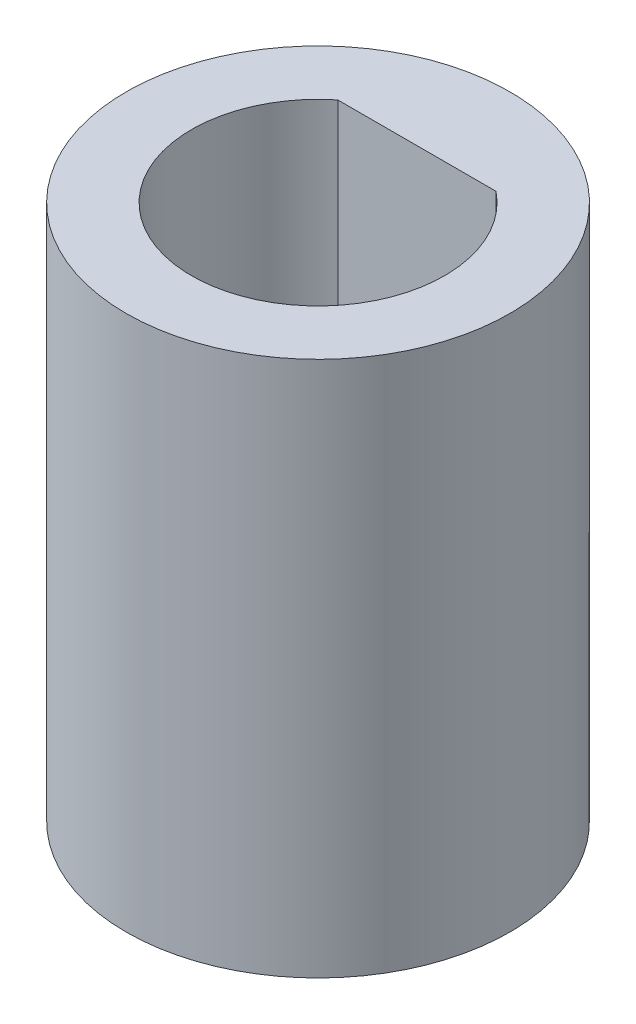
ISO-10303-21;
HEADER;
FILE_DESCRIPTION(('STEP AP214'),'2;1');
FILE_NAME('part.step','',(''),(''),'','','');
FILE_SCHEMA(('AUTOMOTIVE_DESIGN { 1 0 10303 214 1 1 1 1 }'));
ENDSEC;
DATA;
#1=APPLICATION_CONTEXT('core data for automotive mechanical design processes');
#2=APPLICATION_PROTOCOL_DEFINITION('international standard','automotive_design',2000,#1);
#3=PRODUCT_CONTEXT('',#1,'mechanical');
#4=PRODUCT('Part','Part','',(#3));
#5=PRODUCT_RELATED_PRODUCT_CATEGORY('part','',(#4));
#6=PRODUCT_DEFINITION_FORMATION('','',#4);
#7=PRODUCT_DEFINITION_CONTEXT('part definition',#1,'design');
#8=PRODUCT_DEFINITION('design','',#6,#7);
#9=PRODUCT_DEFINITION_SHAPE('','',#8);
#10=(LENGTH_UNIT() NAMED_UNIT(*) SI_UNIT(.MILLI.,.METRE.));
#11=(NAMED_UNIT(*) PLANE_ANGLE_UNIT() SI_UNIT($,.RADIAN.));
#12=(NAMED_UNIT(*) SI_UNIT($,.STERADIAN.) SOLID_ANGLE_UNIT());
#13=UNCERTAINTY_MEASURE_WITH_UNIT(LENGTH_MEASURE(1.E-05),#10,'distance_accuracy_value','');
#14=(GEOMETRIC_REPRESENTATION_CONTEXT(3) GLOBAL_UNCERTAINTY_ASSIGNED_CONTEXT((#13)) GLOBAL_UNIT_ASSIGNED_CONTEXT((#10,
#11,#12)) REPRESENTATION_CONTEXT('',''));
#15=CARTESIAN_POINT('',(0.,0.,0.));
#16=DIRECTION('',(0.,0.,1.));
#17=DIRECTION('',(1.,0.,0.));
#18=AXIS2_PLACEMENT_3D('',#15,#16,#17);
#19=CARTESIAN_POINT('',(0.,-16.4,0.));
#20=DIRECTION('',(0.,1.,0.));
#21=DIRECTION('',(0.,0.,1.));
#22=AXIS2_PLACEMENT_3D('',#19,#20,#21);
#23=CYLINDRICAL_SURFACE('',#22,5.875);
#24=CARTESIAN_POINT('',(0.,-16.4,0.));
#25=DIRECTION('',(0.,1.,0.));
#26=DIRECTION('',(0.,0.,1.));
#27=AXIS2_PLACEMENT_3D('',#24,#25,#26);
#28=CIRCLE('',#27,5.875);
#29=CARTESIAN_POINT('',(0.,-16.4,5.875));
#30=VERTEX_POINT('',#29);
#31=EDGE_CURVE('E11',#30,#30,#28,.T.);
#32=ORIENTED_EDGE('',*,*,#31,.T.);
#33=EDGE_LOOP('',(#32));
#34=FACE_BOUND('',#33,.T.);
#35=CARTESIAN_POINT('',(0.,0.,0.));
#36=DIRECTION('',(0.,1.,0.));
#37=DIRECTION('',(0.,0.,1.));
#38=AXIS2_PLACEMENT_3D('',#35,#36,#37);
#39=CIRCLE('',#38,5.875);
#40=CARTESIAN_POINT('',(0.,0.,5.875));
#41=VERTEX_POINT('',#40);
#42=EDGE_CURVE('E36',#41,#41,#39,.T.);
#43=ORIENTED_EDGE('',*,*,#42,.F.);
#44=EDGE_LOOP('',(#43));
#45=FACE_BOUND('',#44,.T.);
#46=ADVANCED_FACE('F33',(#34,#45),#23,.T.);
#47=CARTESIAN_POINT('',(0.,-16.4,0.));
#48=DIRECTION('',(0.,1.,0.));
#49=DIRECTION('',(0.,0.,1.));
#50=AXIS2_PLACEMENT_3D('',#47,#48,#49);
#51=PLANE('',#50);
#52=DIRECTION('',(-1.,0.,0.));
#53=VECTOR('',#52,1.);
#54=CARTESIAN_POINT('',(-2.42177620766247,-16.4,-3.025));
#55=LINE('',#54,#53);
#56=CARTESIAN_POINT('',(2.42177620766247,-16.4,-3.025));
#57=VERTEX_POINT('',#56);
#58=CARTESIAN_POINT('',(-2.42177620766247,-16.4,-3.025));
#59=VERTEX_POINT('',#58);
#60=EDGE_CURVE('E74',#57,#59,#55,.T.);
#61=ORIENTED_EDGE('',*,*,#60,.T.);
#62=CARTESIAN_POINT('',(0.,-16.4,0.));
#63=DIRECTION('',(0.,1.,0.));
#64=DIRECTION('',(0.,0.,1.));
#65=AXIS2_PLACEMENT_3D('',#62,#63,#64);
#66=CIRCLE('',#65,3.875);
#67=EDGE_CURVE('E47',#59,#57,#66,.T.);
#68=ORIENTED_EDGE('',*,*,#67,.T.);
#69=EDGE_LOOP('',(#61,#68));
#70=FACE_BOUND('',#69,.T.);
#71=ORIENTED_EDGE('',*,*,#31,.F.);
#72=EDGE_LOOP('',(#71));
#73=FACE_BOUND('',#72,.T.);
#74=ADVANCED_FACE('F78',(#70,#73),#51,.F.);
#75=CARTESIAN_POINT('',(0.,0.,0.));
#76=DIRECTION('',(0.,1.,0.));
#77=DIRECTION('',(0.,0.,1.));
#78=AXIS2_PLACEMENT_3D('',#75,#76,#77);
#79=PLANE('',#78);
#80=CARTESIAN_POINT('',(0.,0.,0.));
#81=DIRECTION('',(0.,1.,0.));
#82=DIRECTION('',(0.,0.,1.));
#83=AXIS2_PLACEMENT_3D('',#80,#81,#82);
#84=CIRCLE('',#83,3.875);
#85=CARTESIAN_POINT('',(-2.42177620766247,0.,-3.025));
#86=VERTEX_POINT('',#85);
#87=CARTESIAN_POINT('',(2.42177620766247,0.,-3.025));
#88=VERTEX_POINT('',#87);
#89=EDGE_CURVE('E52',#86,#88,#84,.T.);
#90=ORIENTED_EDGE('',*,*,#89,.F.);
#91=DIRECTION('',(-1.,0.,0.));
#92=VECTOR('',#91,1.);
#93=CARTESIAN_POINT('',(-2.42177620766247,0.,-3.025));
#94=LINE('',#93,#92);
#95=EDGE_CURVE('E66',#88,#86,#94,.T.);
#96=ORIENTED_EDGE('',*,*,#95,.F.);
#97=EDGE_LOOP('',(#90,#96));
#98=FACE_BOUND('',#97,.T.);
#99=ORIENTED_EDGE('',*,*,#42,.T.);
#100=EDGE_LOOP('',(#99));
#101=FACE_BOUND('',#100,.T.);
#102=ADVANCED_FACE('F70',(#98,#101),#79,.T.);
#103=CARTESIAN_POINT('',(0.,-16.4,0.));
#104=DIRECTION('',(0.,1.,0.));
#105=DIRECTION('',(0.,0.,1.));
#106=AXIS2_PLACEMENT_3D('',#103,#104,#105);
#107=CYLINDRICAL_SURFACE('',#106,3.875);
#108=ORIENTED_EDGE('',*,*,#89,.T.);
#109=DIRECTION('',(0.,1.,0.));
#110=VECTOR('',#109,1.);
#111=CARTESIAN_POINT('',(2.42177620766247,-16.4,-3.025));
#112=LINE('',#111,#110);
#113=EDGE_CURVE('E63',#57,#88,#112,.T.);
#114=ORIENTED_EDGE('',*,*,#113,.F.);
#115=ORIENTED_EDGE('',*,*,#67,.F.);
#116=DIRECTION('',(0.,1.,0.));
#117=VECTOR('',#116,1.);
#118=CARTESIAN_POINT('',(-2.42177620766247,-16.4,-3.025));
#119=LINE('',#118,#117);
#120=EDGE_CURVE('E57',#59,#86,#119,.T.);
#121=ORIENTED_EDGE('',*,*,#120,.T.);
#122=EDGE_LOOP('',(#108,#114,#115,#121));
#123=FACE_BOUND('',#122,.T.);
#124=ADVANCED_FACE('F59',(#123),#107,.F.);
#125=CARTESIAN_POINT('',(-2.42177620766247,-16.4,-3.025));
#126=DIRECTION('',(0.,0.,-1.));
#127=DIRECTION('',(-1.,0.,0.));
#128=AXIS2_PLACEMENT_3D('',#125,#126,#127);
#129=PLANE('',#128);
#130=ORIENTED_EDGE('',*,*,#95,.T.);
#131=ORIENTED_EDGE('',*,*,#120,.F.);
#132=ORIENTED_EDGE('',*,*,#60,.F.);
#133=ORIENTED_EDGE('',*,*,#113,.T.);
#134=EDGE_LOOP('',(#130,#131,#132,#133));
#135=FACE_BOUND('',#134,.T.);
#136=ADVANCED_FACE('F67',(#135),#129,.F.);
#137=CLOSED_SHELL('',(#46,#74,#102,#124,#136));
#138=MANIFOLD_SOLID_BREP('B2',#137);
#139=ADVANCED_BREP_SHAPE_REPRESENTATION('',(#18,#138),#14);
#140=SHAPE_DEFINITION_REPRESENTATION(#9,#139);
ENDSEC;
END-ISO-10303-21;
